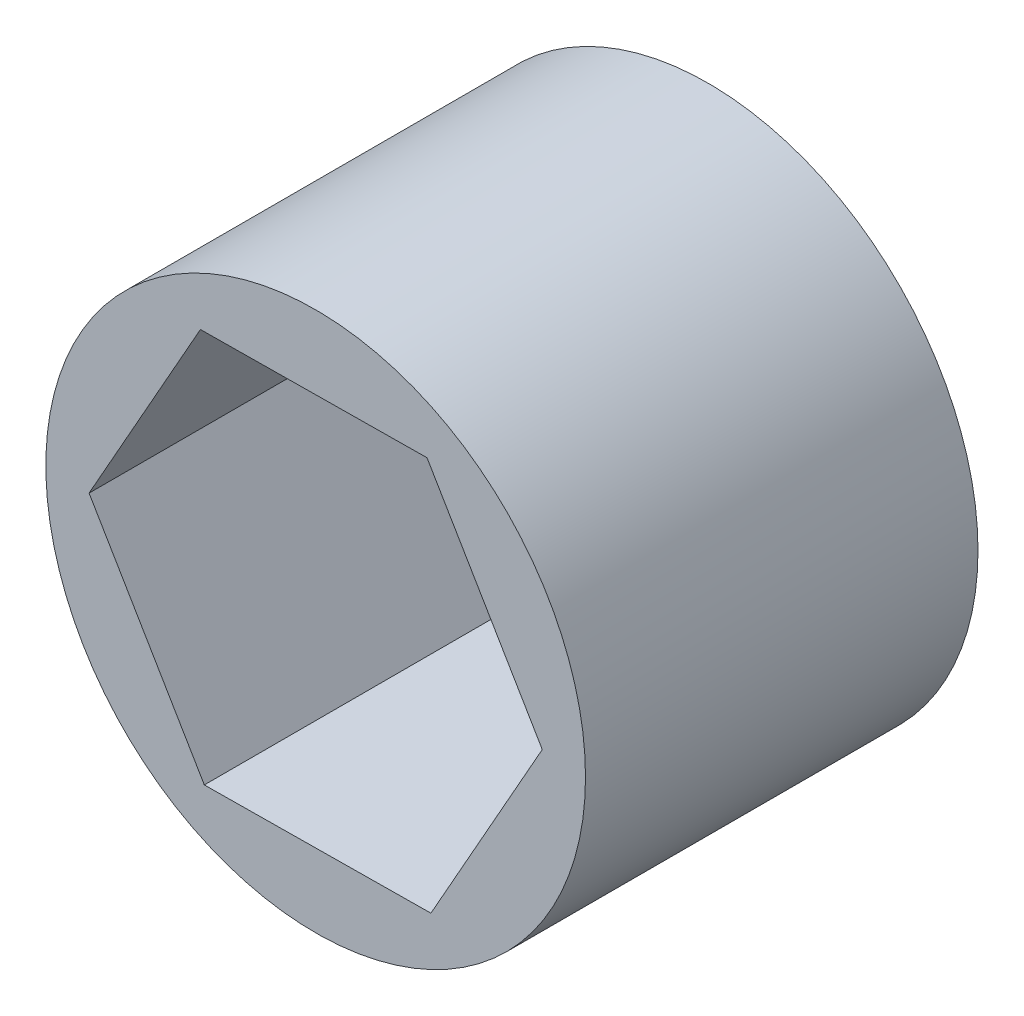
ISO-10303-21;
HEADER;
FILE_DESCRIPTION(('STEP AP214'),'2;1');
FILE_NAME('part.step','',(''),(''),'','','');
FILE_SCHEMA(('AUTOMOTIVE_DESIGN { 1 0 10303 214 1 1 1 1 }'));
ENDSEC;
DATA;
#1=APPLICATION_CONTEXT('core data for automotive mechanical design processes');
#2=APPLICATION_PROTOCOL_DEFINITION('international standard','automotive_design',2000,#1);
#3=PRODUCT_CONTEXT('',#1,'mechanical');
#4=PRODUCT('Part','Part','',(#3));
#5=PRODUCT_RELATED_PRODUCT_CATEGORY('part','',(#4));
#6=PRODUCT_DEFINITION_FORMATION('','',#4);
#7=PRODUCT_DEFINITION_CONTEXT('part definition',#1,'design');
#8=PRODUCT_DEFINITION('design','',#6,#7);
#9=PRODUCT_DEFINITION_SHAPE('','',#8);
#10=(LENGTH_UNIT() NAMED_UNIT(*) SI_UNIT(.MILLI.,.METRE.));
#11=(NAMED_UNIT(*) PLANE_ANGLE_UNIT() SI_UNIT($,.RADIAN.));
#12=(NAMED_UNIT(*) SI_UNIT($,.STERADIAN.) SOLID_ANGLE_UNIT());
#13=UNCERTAINTY_MEASURE_WITH_UNIT(LENGTH_MEASURE(1.E-05),#10,'distance_accuracy_value','');
#14=(GEOMETRIC_REPRESENTATION_CONTEXT(3) GLOBAL_UNCERTAINTY_ASSIGNED_CONTEXT((#13)) GLOBAL_UNIT_ASSIGNED_CONTEXT((#10,
#11,#12)) REPRESENTATION_CONTEXT('',''));
#15=CARTESIAN_POINT('',(0.,0.,0.));
#16=DIRECTION('',(0.,0.,1.));
#17=DIRECTION('',(1.,0.,0.));
#18=AXIS2_PLACEMENT_3D('',#15,#16,#17);
#19=CARTESIAN_POINT('',(0.,0.,12.7));
#20=DIRECTION('',(0.,0.,-1.));
#21=DIRECTION('',(-1.,0.,0.));
#22=AXIS2_PLACEMENT_3D('',#19,#20,#21);
#23=CYLINDRICAL_SURFACE('',#22,8.73125);
#24=CARTESIAN_POINT('',(0.,0.,12.7));
#25=DIRECTION('',(0.,0.,1.));
#26=DIRECTION('',(1.,0.,0.));
#27=AXIS2_PLACEMENT_3D('',#24,#25,#26);
#28=CIRCLE('',#27,8.73125);
#29=CARTESIAN_POINT('',(8.73125,0.,12.7));
#30=VERTEX_POINT('',#29);
#31=EDGE_CURVE('E11',#30,#30,#28,.T.);
#32=ORIENTED_EDGE('',*,*,#31,.F.);
#33=EDGE_LOOP('',(#32));
#34=FACE_BOUND('',#33,.T.);
#35=CARTESIAN_POINT('',(0.,0.,0.));
#36=DIRECTION('',(0.,0.,1.));
#37=DIRECTION('',(1.,0.,0.));
#38=AXIS2_PLACEMENT_3D('',#35,#36,#37);
#39=CIRCLE('',#38,8.73125);
#40=CARTESIAN_POINT('',(8.73125,0.,0.));
#41=VERTEX_POINT('',#40);
#42=EDGE_CURVE('E36',#41,#41,#39,.T.);
#43=ORIENTED_EDGE('',*,*,#42,.T.);
#44=EDGE_LOOP('',(#43));
#45=FACE_BOUND('',#44,.T.);
#46=ADVANCED_FACE('F33',(#34,#45),#23,.T.);
#47=CARTESIAN_POINT('',(0.,0.,12.7));
#48=DIRECTION('',(0.,0.,1.));
#49=DIRECTION('',(1.,0.,0.));
#50=AXIS2_PLACEMENT_3D('',#47,#48,#49);
#51=PLANE('',#50);
#52=DIRECTION('',(0.999950907031534,0.00990876010468385,0.));
#53=VECTOR('',#52,1.);
#54=CARTESIAN_POINT('',(-3.60307359931453,-6.38601550039271,12.7));
#55=LINE('',#54,#53);
#56=CARTESIAN_POINT('',(-3.60307359931453,-6.38601550039271,12.7));
#57=VERTEX_POINT('',#56);
#58=CARTESIAN_POINT('',(3.72891485264401,-6.31336101890777,12.7));
#59=VERTEX_POINT('',#58);
#60=EDGE_CURVE('E47',#57,#59,#55,.T.);
#61=ORIENTED_EDGE('',*,*,#60,.F.);
#62=DIRECTION('',(0.508556691486429,-0.861028507974258,0.));
#63=VECTOR('',#62,1.);
#64=CARTESIAN_POINT('',(-7.33198845195855,-0.0726544814849366,12.7));
#65=LINE('',#64,#63);
#66=CARTESIAN_POINT('',(-7.33198845195855,-0.0726544814849366,12.7));
#67=VERTEX_POINT('',#66);
#68=EDGE_CURVE('E104',#67,#57,#65,.T.);
#69=ORIENTED_EDGE('',*,*,#68,.F.);
#70=DIRECTION('',(-0.491394215545105,-0.870937268078942,0.));
#71=VECTOR('',#70,1.);
#72=CARTESIAN_POINT('',(-3.72891485264402,6.31336101890777,12.7));
#73=LINE('',#72,#71);
#74=CARTESIAN_POINT('',(-3.72891485264402,6.31336101890777,12.7));
#75=VERTEX_POINT('',#74);
#76=EDGE_CURVE('E107',#75,#67,#73,.T.);
#77=ORIENTED_EDGE('',*,*,#76,.F.);
#78=DIRECTION('',(-0.999950907031534,-0.00990876010468373,0.));
#79=VECTOR('',#78,1.);
#80=CARTESIAN_POINT('',(3.60307359931453,6.38601550039271,12.7));
#81=LINE('',#80,#79);
#82=CARTESIAN_POINT('',(3.60307359931453,6.38601550039271,12.7));
#83=VERTEX_POINT('',#82);
#84=EDGE_CURVE('E123',#83,#75,#81,.T.);
#85=ORIENTED_EDGE('',*,*,#84,.F.);
#86=DIRECTION('',(-0.508556691486429,0.861028507974258,0.));
#87=VECTOR('',#86,1.);
#88=CARTESIAN_POINT('',(7.33198845195854,0.0726544814849384,12.7));
#89=LINE('',#88,#87);
#90=CARTESIAN_POINT('',(7.33198845195854,0.0726544814849384,12.7));
#91=VERTEX_POINT('',#90);
#92=EDGE_CURVE('E120',#91,#83,#89,.T.);
#93=ORIENTED_EDGE('',*,*,#92,.F.);
#94=DIRECTION('',(0.491394215545105,0.870937268078942,0.));
#95=VECTOR('',#94,1.);
#96=CARTESIAN_POINT('',(3.72891485264401,-6.31336101890777,12.7));
#97=LINE('',#96,#95);
#98=EDGE_CURVE('E118',#59,#91,#97,.T.);
#99=ORIENTED_EDGE('',*,*,#98,.F.);
#100=EDGE_LOOP('',(#61,#69,#77,#85,#93,#99));
#101=FACE_BOUND('',#100,.T.);
#102=ORIENTED_EDGE('',*,*,#31,.T.);
#103=EDGE_LOOP('',(#102));
#104=FACE_BOUND('',#103,.T.);
#105=ADVANCED_FACE('F140',(#101,#104),#51,.T.);
#106=CARTESIAN_POINT('',(0.,0.,0.));
#107=DIRECTION('',(0.,0.,1.));
#108=DIRECTION('',(1.,0.,0.));
#109=AXIS2_PLACEMENT_3D('',#106,#107,#108);
#110=PLANE('',#109);
#111=DIRECTION('',(0.508556691486429,-0.861028507974258,0.));
#112=VECTOR('',#111,1.);
#113=CARTESIAN_POINT('',(-7.33198845195855,-0.0726544814849366,0.));
#114=LINE('',#113,#112);
#115=CARTESIAN_POINT('',(-7.33198845195855,-0.0726544814849366,0.));
#116=VERTEX_POINT('',#115);
#117=CARTESIAN_POINT('',(-3.60307359931453,-6.38601550039271,0.));
#118=VERTEX_POINT('',#117);
#119=EDGE_CURVE('E93',#116,#118,#114,.T.);
#120=ORIENTED_EDGE('',*,*,#119,.T.);
#121=DIRECTION('',(0.999950907031534,0.00990876010468385,0.));
#122=VECTOR('',#121,1.);
#123=CARTESIAN_POINT('',(-3.60307359931453,-6.38601550039271,0.));
#124=LINE('',#123,#122);
#125=CARTESIAN_POINT('',(3.72891485264401,-6.31336101890777,0.));
#126=VERTEX_POINT('',#125);
#127=EDGE_CURVE('E87',#118,#126,#124,.T.);
#128=ORIENTED_EDGE('',*,*,#127,.T.);
#129=DIRECTION('',(0.491394215545105,0.870937268078942,0.));
#130=VECTOR('',#129,1.);
#131=CARTESIAN_POINT('',(3.72891485264401,-6.31336101890777,0.));
#132=LINE('',#131,#130);
#133=CARTESIAN_POINT('',(7.33198845195854,0.0726544814849388,0.));
#134=VERTEX_POINT('',#133);
#135=EDGE_CURVE('E96',#126,#134,#132,.T.);
#136=ORIENTED_EDGE('',*,*,#135,.T.);
#137=DIRECTION('',(-0.508556691486429,0.861028507974258,0.));
#138=VECTOR('',#137,1.);
#139=CARTESIAN_POINT('',(7.33198845195854,0.0726544814849384,0.));
#140=LINE('',#139,#138);
#141=CARTESIAN_POINT('',(3.60307359931453,6.38601550039271,0.));
#142=VERTEX_POINT('',#141);
#143=EDGE_CURVE('E55',#134,#142,#140,.T.);
#144=ORIENTED_EDGE('',*,*,#143,.T.);
#145=DIRECTION('',(-0.999950907031534,-0.00990876010468373,0.));
#146=VECTOR('',#145,1.);
#147=CARTESIAN_POINT('',(3.60307359931453,6.38601550039271,0.));
#148=LINE('',#147,#146);
#149=CARTESIAN_POINT('',(-3.72891485264402,6.31336101890777,0.));
#150=VERTEX_POINT('',#149);
#151=EDGE_CURVE('E111',#142,#150,#148,.T.);
#152=ORIENTED_EDGE('',*,*,#151,.T.);
#153=DIRECTION('',(-0.491394215545105,-0.870937268078942,0.));
#154=VECTOR('',#153,1.);
#155=CARTESIAN_POINT('',(-3.72891485264402,6.31336101890777,0.));
#156=LINE('',#155,#154);
#157=EDGE_CURVE('E114',#150,#116,#156,.T.);
#158=ORIENTED_EDGE('',*,*,#157,.T.);
#159=EDGE_LOOP('',(#120,#128,#136,#144,#152,#158));
#160=FACE_BOUND('',#159,.T.);
#161=ORIENTED_EDGE('',*,*,#42,.F.);
#162=EDGE_LOOP('',(#161));
#163=FACE_BOUND('',#162,.T.);
#164=ADVANCED_FACE('F100',(#160,#163),#110,.F.);
#165=CARTESIAN_POINT('',(-3.60307359931453,-6.38601550039271,0.));
#166=DIRECTION('',(0.00990876010468385,-0.999950907031534,0.));
#167=DIRECTION('',(0.999950907031534,0.00990876010468385,0.));
#168=AXIS2_PLACEMENT_3D('',#165,#166,#167);
#169=PLANE('',#168);
#170=ORIENTED_EDGE('',*,*,#60,.T.);
#171=DIRECTION('',(0.,0.,1.));
#172=VECTOR('',#171,1.);
#173=CARTESIAN_POINT('',(3.72891485264401,-6.31336101890777,0.));
#174=LINE('',#173,#172);
#175=EDGE_CURVE('E83',#126,#59,#174,.T.);
#176=ORIENTED_EDGE('',*,*,#175,.F.);
#177=ORIENTED_EDGE('',*,*,#127,.F.);
#178=DIRECTION('',(0.,0.,1.));
#179=VECTOR('',#178,1.);
#180=CARTESIAN_POINT('',(-3.60307359931453,-6.38601550039271,0.));
#181=LINE('',#180,#179);
#182=EDGE_CURVE('E128',#118,#57,#181,.T.);
#183=ORIENTED_EDGE('',*,*,#182,.T.);
#184=EDGE_LOOP('',(#170,#176,#177,#183));
#185=FACE_BOUND('',#184,.T.);
#186=ADVANCED_FACE('F85',(#185),#169,.F.);
#187=CARTESIAN_POINT('',(-7.33198845195855,-0.0726544814849366,0.));
#188=DIRECTION('',(-0.861028507974258,-0.508556691486429,0.));
#189=DIRECTION('',(0.508556691486429,-0.861028507974258,0.));
#190=AXIS2_PLACEMENT_3D('',#187,#188,#189);
#191=PLANE('',#190);
#192=ORIENTED_EDGE('',*,*,#68,.T.);
#193=ORIENTED_EDGE('',*,*,#182,.F.);
#194=ORIENTED_EDGE('',*,*,#119,.F.);
#195=DIRECTION('',(0.,0.,1.));
#196=VECTOR('',#195,1.);
#197=CARTESIAN_POINT('',(-7.33198845195855,-0.0726544814849366,0.));
#198=LINE('',#197,#196);
#199=EDGE_CURVE('E130',#116,#67,#198,.T.);
#200=ORIENTED_EDGE('',*,*,#199,.T.);
#201=EDGE_LOOP('',(#192,#193,#194,#200));
#202=FACE_BOUND('',#201,.T.);
#203=ADVANCED_FACE('F151',(#202),#191,.F.);
#204=CARTESIAN_POINT('',(-3.72891485264402,6.31336101890777,0.));
#205=DIRECTION('',(-0.870937268078942,0.491394215545105,0.));
#206=DIRECTION('',(-0.491394215545105,-0.870937268078942,0.));
#207=AXIS2_PLACEMENT_3D('',#204,#205,#206);
#208=PLANE('',#207);
#209=ORIENTED_EDGE('',*,*,#76,.T.);
#210=ORIENTED_EDGE('',*,*,#199,.F.);
#211=ORIENTED_EDGE('',*,*,#157,.F.);
#212=DIRECTION('',(0.,0.,1.));
#213=VECTOR('',#212,1.);
#214=CARTESIAN_POINT('',(-3.72891485264402,6.31336101890777,0.));
#215=LINE('',#214,#213);
#216=EDGE_CURVE('E132',#150,#75,#215,.T.);
#217=ORIENTED_EDGE('',*,*,#216,.T.);
#218=EDGE_LOOP('',(#209,#210,#211,#217));
#219=FACE_BOUND('',#218,.T.);
#220=ADVANCED_FACE('F149',(#219),#208,.F.);
#221=CARTESIAN_POINT('',(3.60307359931453,6.38601550039271,0.));
#222=DIRECTION('',(-0.00990876010468373,0.999950907031534,0.));
#223=DIRECTION('',(-0.999950907031534,-0.00990876010468373,0.));
#224=AXIS2_PLACEMENT_3D('',#221,#222,#223);
#225=PLANE('',#224);
#226=ORIENTED_EDGE('',*,*,#84,.T.);
#227=ORIENTED_EDGE('',*,*,#216,.F.);
#228=ORIENTED_EDGE('',*,*,#151,.F.);
#229=DIRECTION('',(0.,0.,1.));
#230=VECTOR('',#229,1.);
#231=CARTESIAN_POINT('',(3.60307359931453,6.38601550039271,0.));
#232=LINE('',#231,#230);
#233=EDGE_CURVE('E134',#142,#83,#232,.T.);
#234=ORIENTED_EDGE('',*,*,#233,.T.);
#235=EDGE_LOOP('',(#226,#227,#228,#234));
#236=FACE_BOUND('',#235,.T.);
#237=ADVANCED_FACE('F145',(#236),#225,.F.);
#238=CARTESIAN_POINT('',(7.33198845195854,0.0726544814849384,0.));
#239=DIRECTION('',(0.861028507974258,0.508556691486429,0.));
#240=DIRECTION('',(-0.508556691486429,0.861028507974258,0.));
#241=AXIS2_PLACEMENT_3D('',#238,#239,#240);
#242=PLANE('',#241);
#243=ORIENTED_EDGE('',*,*,#92,.T.);
#244=ORIENTED_EDGE('',*,*,#233,.F.);
#245=ORIENTED_EDGE('',*,*,#143,.F.);
#246=DIRECTION('',(0.,0.,1.));
#247=VECTOR('',#246,1.);
#248=CARTESIAN_POINT('',(7.33198845195854,0.0726544814849384,0.));
#249=LINE('',#248,#247);
#250=EDGE_CURVE('E92',#134,#91,#249,.T.);
#251=ORIENTED_EDGE('',*,*,#250,.T.);
#252=EDGE_LOOP('',(#243,#244,#245,#251));
#253=FACE_BOUND('',#252,.T.);
#254=ADVANCED_FACE('F136',(#253),#242,.F.);
#255=CARTESIAN_POINT('',(3.72891485264401,-6.31336101890777,0.));
#256=DIRECTION('',(0.870937268078942,-0.491394215545105,0.));
#257=DIRECTION('',(0.491394215545105,0.870937268078942,0.));
#258=AXIS2_PLACEMENT_3D('',#255,#256,#257);
#259=PLANE('',#258);
#260=ORIENTED_EDGE('',*,*,#98,.T.);
#261=ORIENTED_EDGE('',*,*,#250,.F.);
#262=ORIENTED_EDGE('',*,*,#135,.F.);
#263=ORIENTED_EDGE('',*,*,#175,.T.);
#264=EDGE_LOOP('',(#260,#261,#262,#263));
#265=FACE_BOUND('',#264,.T.);
#266=ADVANCED_FACE('F97',(#265),#259,.F.);
#267=CLOSED_SHELL('',(#46,#105,#164,#186,#203,#220,#237,#254,#266));
#268=MANIFOLD_SOLID_BREP('B2',#267);
#269=ADVANCED_BREP_SHAPE_REPRESENTATION('',(#18,#268),#14);
#270=SHAPE_DEFINITION_REPRESENTATION(#9,#269);
ENDSEC;
END-ISO-10303-21;
